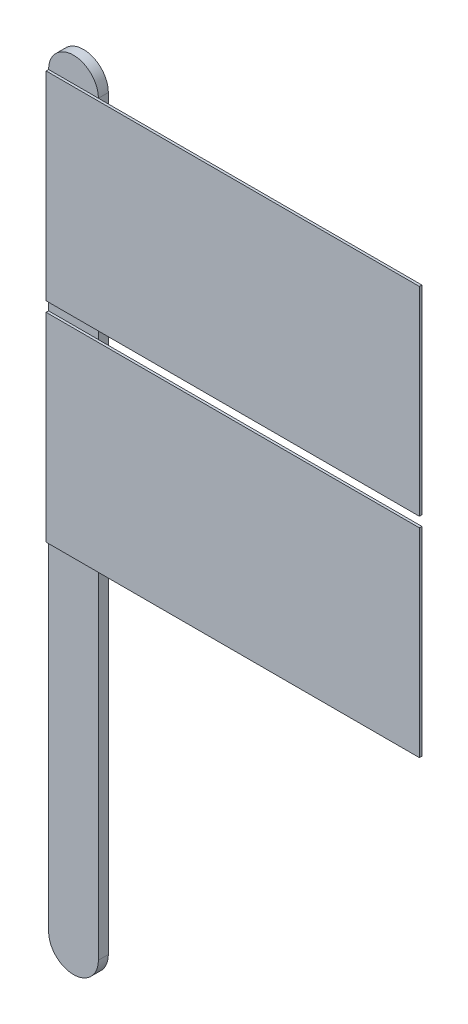
ISO-10303-21;
HEADER;
FILE_DESCRIPTION(('STEP AP214'),'2;1');
FILE_NAME('part.step','',(''),(''),'','','');
FILE_SCHEMA(('AUTOMOTIVE_DESIGN { 1 0 10303 214 1 1 1 1 }'));
ENDSEC;
DATA;
#1=APPLICATION_CONTEXT('core data for automotive mechanical design processes');
#2=APPLICATION_PROTOCOL_DEFINITION('international standard','automotive_design',2000,#1);
#3=PRODUCT_CONTEXT('',#1,'mechanical');
#4=PRODUCT('Part','Part','',(#3));
#5=PRODUCT_RELATED_PRODUCT_CATEGORY('part','',(#4));
#6=PRODUCT_DEFINITION_FORMATION('','',#4);
#7=PRODUCT_DEFINITION_CONTEXT('part definition',#1,'design');
#8=PRODUCT_DEFINITION('design','',#6,#7);
#9=PRODUCT_DEFINITION_SHAPE('','',#8);
#10=(LENGTH_UNIT() NAMED_UNIT(*) SI_UNIT(.MILLI.,.METRE.));
#11=(NAMED_UNIT(*) PLANE_ANGLE_UNIT() SI_UNIT($,.RADIAN.));
#12=(NAMED_UNIT(*) SI_UNIT($,.STERADIAN.) SOLID_ANGLE_UNIT());
#13=UNCERTAINTY_MEASURE_WITH_UNIT(LENGTH_MEASURE(1.E-05),#10,'distance_accuracy_value','');
#14=(GEOMETRIC_REPRESENTATION_CONTEXT(3) GLOBAL_UNCERTAINTY_ASSIGNED_CONTEXT((#13)) GLOBAL_UNIT_ASSIGNED_CONTEXT((#10,
#11,#12)) REPRESENTATION_CONTEXT('',''));
#15=CARTESIAN_POINT('',(0.,0.,0.));
#16=DIRECTION('',(0.,0.,1.));
#17=DIRECTION('',(1.,0.,0.));
#18=AXIS2_PLACEMENT_3D('',#15,#16,#17);
#19=CARTESIAN_POINT('',(0.,0.,2.));
#20=DIRECTION('',(0.,0.,1.));
#21=DIRECTION('',(1.,0.,0.));
#22=AXIS2_PLACEMENT_3D('',#19,#20,#21);
#23=PLANE('',#22);
#24=DIRECTION('',(0.,1.,0.));
#25=VECTOR('',#24,1.);
#26=CARTESIAN_POINT('',(5.,0.,2.));
#27=LINE('',#26,#25);
#28=CARTESIAN_POINT('',(5.,0.,2.));
#29=VERTEX_POINT('',#28);
#30=CARTESIAN_POINT('',(5.,68.,2.));
#31=VERTEX_POINT('',#30);
#32=EDGE_CURVE('E194',#29,#31,#27,.T.);
#33=ORIENTED_EDGE('',*,*,#32,.T.);
#34=DIRECTION('',(1.,0.,0.));
#35=VECTOR('',#34,1.);
#36=CARTESIAN_POINT('',(-5.,68.,2.));
#37=LINE('',#36,#35);
#38=CARTESIAN_POINT('',(-5.,68.,2.));
#39=VERTEX_POINT('',#38);
#40=EDGE_CURVE('E407',#39,#31,#37,.T.);
#41=ORIENTED_EDGE('',*,*,#40,.F.);
#42=DIRECTION('',(0.,-1.,0.));
#43=VECTOR('',#42,1.);
#44=CARTESIAN_POINT('',(-5.,0.,2.));
#45=LINE('',#44,#43);
#46=CARTESIAN_POINT('',(-5.,0.,2.));
#47=VERTEX_POINT('',#46);
#48=EDGE_CURVE('E154',#39,#47,#45,.T.);
#49=ORIENTED_EDGE('',*,*,#48,.T.);
#50=CARTESIAN_POINT('',(0.,0.,2.));
#51=DIRECTION('',(0.,0.,1.));
#52=DIRECTION('',(1.,0.,0.));
#53=AXIS2_PLACEMENT_3D('',#50,#51,#52);
#54=CIRCLE('',#53,5.);
#55=EDGE_CURVE('E189',#47,#29,#54,.T.);
#56=ORIENTED_EDGE('',*,*,#55,.T.);
#57=EDGE_LOOP('',(#33,#41,#49,#56));
#58=FACE_BOUND('',#57,.T.);
#59=ADVANCED_FACE('F33',(#58),#23,.T.);
#60=CARTESIAN_POINT('',(-5.,110.,2.));
#61=VERTEX_POINT('',#60);
#62=CARTESIAN_POINT('',(-5.,108.,2.));
#63=VERTEX_POINT('',#62);
#64=EDGE_CURVE('E201',#61,#63,#45,.T.);
#65=ORIENTED_EDGE('',*,*,#64,.T.);
#66=DIRECTION('',(1.,0.,0.));
#67=VECTOR('',#66,1.);
#68=CARTESIAN_POINT('',(0.,108.,2.));
#69=LINE('',#68,#67);
#70=CARTESIAN_POINT('',(5.,108.,2.));
#71=VERTEX_POINT('',#70);
#72=EDGE_CURVE('E11',#63,#71,#69,.T.);
#73=ORIENTED_EDGE('',*,*,#72,.T.);
#74=CARTESIAN_POINT('',(5.,110.,2.));
#75=VERTEX_POINT('',#74);
#76=EDGE_CURVE('E199',#71,#75,#27,.T.);
#77=ORIENTED_EDGE('',*,*,#76,.T.);
#78=DIRECTION('',(1.,0.,0.));
#79=VECTOR('',#78,1.);
#80=CARTESIAN_POINT('',(-4.99999999999999,110.,2.));
#81=LINE('',#80,#79);
#82=EDGE_CURVE('E56',#61,#75,#81,.T.);
#83=ORIENTED_EDGE('',*,*,#82,.F.);
#84=EDGE_LOOP('',(#65,#73,#77,#83));
#85=FACE_BOUND('',#84,.T.);
#86=ADVANCED_FACE('F252',(#85),#23,.T.);
#87=DIRECTION('',(-1.,0.,0.));
#88=VECTOR('',#87,1.);
#89=CARTESIAN_POINT('',(-5.,150.,2.));
#90=LINE('',#89,#88);
#91=CARTESIAN_POINT('',(5.,150.,2.));
#92=VERTEX_POINT('',#91);
#93=CARTESIAN_POINT('',(-5.,150.,2.));
#94=VERTEX_POINT('',#93);
#95=EDGE_CURVE('E41',#92,#94,#90,.T.);
#96=ORIENTED_EDGE('',*,*,#95,.F.);
#97=CARTESIAN_POINT('',(0.,150.,2.));
#98=DIRECTION('',(0.,0.,1.));
#99=DIRECTION('',(1.,0.,0.));
#100=AXIS2_PLACEMENT_3D('',#97,#98,#99);
#101=CIRCLE('',#100,5.);
#102=EDGE_CURVE('E197',#92,#94,#101,.T.);
#103=ORIENTED_EDGE('',*,*,#102,.T.);
#104=EDGE_LOOP('',(#96,#103));
#105=FACE_BOUND('',#104,.T.);
#106=ADVANCED_FACE('F262',(#105),#23,.T.);
#107=CARTESIAN_POINT('',(0.,0.,2.));
#108=DIRECTION('',(0.,0.,-1.));
#109=DIRECTION('',(-1.,0.,0.));
#110=AXIS2_PLACEMENT_3D('',#107,#108,#109);
#111=CYLINDRICAL_SURFACE('',#110,5.);
#112=CARTESIAN_POINT('',(0.,0.,0.));
#113=DIRECTION('',(0.,0.,1.));
#114=DIRECTION('',(1.,0.,0.));
#115=AXIS2_PLACEMENT_3D('',#112,#113,#114);
#116=CIRCLE('',#115,5.);
#117=CARTESIAN_POINT('',(-5.,0.,0.));
#118=VERTEX_POINT('',#117);
#119=CARTESIAN_POINT('',(5.,0.,0.));
#120=VERTEX_POINT('',#119);
#121=EDGE_CURVE('E188',#118,#120,#116,.T.);
#122=ORIENTED_EDGE('',*,*,#121,.T.);
#123=DIRECTION('',(0.,0.,-1.));
#124=VECTOR('',#123,1.);
#125=CARTESIAN_POINT('',(5.,0.,2.));
#126=LINE('',#125,#124);
#127=EDGE_CURVE('E218',#29,#120,#126,.T.);
#128=ORIENTED_EDGE('',*,*,#127,.F.);
#129=ORIENTED_EDGE('',*,*,#55,.F.);
#130=DIRECTION('',(0.,0.,-1.));
#131=VECTOR('',#130,1.);
#132=CARTESIAN_POINT('',(-5.,0.,2.));
#133=LINE('',#132,#131);
#134=EDGE_CURVE('E203',#47,#118,#133,.T.);
#135=ORIENTED_EDGE('',*,*,#134,.T.);
#136=EDGE_LOOP('',(#122,#128,#129,#135));
#137=FACE_BOUND('',#136,.T.);
#138=ADVANCED_FACE('F35',(#137),#111,.T.);
#139=CARTESIAN_POINT('',(5.,0.,2.));
#140=DIRECTION('',(-1.,0.,0.));
#141=DIRECTION('',(0.,0.,1.));
#142=AXIS2_PLACEMENT_3D('',#139,#140,#141);
#143=PLANE('',#142);
#144=DIRECTION('',(0.,1.,0.));
#145=VECTOR('',#144,1.);
#146=CARTESIAN_POINT('',(5.,0.,0.));
#147=LINE('',#146,#145);
#148=CARTESIAN_POINT('',(5.,150.,0.));
#149=VERTEX_POINT('',#148);
#150=EDGE_CURVE('E206',#120,#149,#147,.T.);
#151=ORIENTED_EDGE('',*,*,#150,.T.);
#152=DIRECTION('',(0.,0.,-1.));
#153=VECTOR('',#152,1.);
#154=CARTESIAN_POINT('',(5.,150.,2.));
#155=LINE('',#154,#153);
#156=EDGE_CURVE('E216',#92,#149,#155,.T.);
#157=ORIENTED_EDGE('',*,*,#156,.F.);
#158=EDGE_CURVE('E192',#75,#92,#27,.T.);
#159=ORIENTED_EDGE('',*,*,#158,.F.);
#160=ORIENTED_EDGE('',*,*,#76,.F.);
#161=EDGE_CURVE('E198',#31,#71,#27,.T.);
#162=ORIENTED_EDGE('',*,*,#161,.F.);
#163=ORIENTED_EDGE('',*,*,#32,.F.);
#164=ORIENTED_EDGE('',*,*,#127,.T.);
#165=EDGE_LOOP('',(#151,#157,#159,#160,#162,#163,#164));
#166=FACE_BOUND('',#165,.T.);
#167=ADVANCED_FACE('F253',(#166),#143,.F.);
#168=CARTESIAN_POINT('',(0.,150.,2.));
#169=DIRECTION('',(0.,0.,-1.));
#170=DIRECTION('',(-1.,0.,0.));
#171=AXIS2_PLACEMENT_3D('',#168,#169,#170);
#172=CYLINDRICAL_SURFACE('',#171,5.);
#173=CARTESIAN_POINT('',(0.,150.,0.));
#174=DIRECTION('',(0.,0.,1.));
#175=DIRECTION('',(1.,0.,0.));
#176=AXIS2_PLACEMENT_3D('',#173,#174,#175);
#177=CIRCLE('',#176,5.);
#178=CARTESIAN_POINT('',(-5.,150.,0.));
#179=VERTEX_POINT('',#178);
#180=EDGE_CURVE('E208',#149,#179,#177,.T.);
#181=ORIENTED_EDGE('',*,*,#180,.T.);
#182=DIRECTION('',(0.,0.,-1.));
#183=VECTOR('',#182,1.);
#184=CARTESIAN_POINT('',(-5.,150.,2.));
#185=LINE('',#184,#183);
#186=EDGE_CURVE('E213',#94,#179,#185,.T.);
#187=ORIENTED_EDGE('',*,*,#186,.F.);
#188=ORIENTED_EDGE('',*,*,#102,.F.);
#189=ORIENTED_EDGE('',*,*,#156,.T.);
#190=EDGE_LOOP('',(#181,#187,#188,#189));
#191=FACE_BOUND('',#190,.T.);
#192=ADVANCED_FACE('F255',(#191),#172,.T.);
#193=CARTESIAN_POINT('',(-5.,0.,2.));
#194=DIRECTION('',(1.,0.,0.));
#195=DIRECTION('',(0.,0.,-1.));
#196=AXIS2_PLACEMENT_3D('',#193,#194,#195);
#197=PLANE('',#196);
#198=DIRECTION('',(0.,-1.,0.));
#199=VECTOR('',#198,1.);
#200=CARTESIAN_POINT('',(-5.,0.,0.));
#201=LINE('',#200,#199);
#202=EDGE_CURVE('E193',#179,#118,#201,.T.);
#203=ORIENTED_EDGE('',*,*,#202,.T.);
#204=ORIENTED_EDGE('',*,*,#134,.F.);
#205=ORIENTED_EDGE('',*,*,#48,.F.);
#206=DIRECTION('',(0.,0.,-1.));
#207=VECTOR('',#206,1.);
#208=CARTESIAN_POINT('',(-5.,68.,2.5));
#209=LINE('',#208,#207);
#210=CARTESIAN_POINT('',(-5.,68.,2.5));
#211=VERTEX_POINT('',#210);
#212=EDGE_CURVE('E134',#211,#39,#209,.T.);
#213=ORIENTED_EDGE('',*,*,#212,.F.);
#214=DIRECTION('',(0.,-1.,0.));
#215=VECTOR('',#214,1.);
#216=CARTESIAN_POINT('',(-5.,108.,2.5));
#217=LINE('',#216,#215);
#218=CARTESIAN_POINT('',(-5.,108.,2.5));
#219=VERTEX_POINT('',#218);
#220=EDGE_CURVE('E141',#219,#211,#217,.T.);
#221=ORIENTED_EDGE('',*,*,#220,.F.);
#222=DIRECTION('',(0.,0.,-1.));
#223=VECTOR('',#222,1.);
#224=CARTESIAN_POINT('',(-5.,108.,2.5));
#225=LINE('',#224,#223);
#226=EDGE_CURVE('E409',#219,#63,#225,.T.);
#227=ORIENTED_EDGE('',*,*,#226,.T.);
#228=ORIENTED_EDGE('',*,*,#64,.F.);
#229=DIRECTION('',(0.,0.,-1.));
#230=VECTOR('',#229,1.);
#231=CARTESIAN_POINT('',(-4.99999999999999,110.,2.5));
#232=LINE('',#231,#230);
#233=CARTESIAN_POINT('',(-4.99999999999999,110.,2.5));
#234=VERTEX_POINT('',#233);
#235=EDGE_CURVE('E185',#234,#61,#232,.T.);
#236=ORIENTED_EDGE('',*,*,#235,.F.);
#237=DIRECTION('',(0.,-1.,0.));
#238=VECTOR('',#237,1.);
#239=CARTESIAN_POINT('',(-5.,150.,2.5));
#240=LINE('',#239,#238);
#241=CARTESIAN_POINT('',(-5.,150.,2.5));
#242=VERTEX_POINT('',#241);
#243=EDGE_CURVE('E162',#242,#234,#240,.T.);
#244=ORIENTED_EDGE('',*,*,#243,.F.);
#245=DIRECTION('',(0.,0.,-1.));
#246=VECTOR('',#245,1.);
#247=CARTESIAN_POINT('',(-5.,150.,2.5));
#248=LINE('',#247,#246);
#249=EDGE_CURVE('E171',#242,#94,#248,.T.);
#250=ORIENTED_EDGE('',*,*,#249,.T.);
#251=ORIENTED_EDGE('',*,*,#186,.T.);
#252=EDGE_LOOP('',(#203,#204,#205,#213,#221,#227,#228,#236,#244,#250,#251));
#253=FACE_BOUND('',#252,.T.);
#254=ADVANCED_FACE('F152',(#253),#197,.F.);
#255=CARTESIAN_POINT('',(0.,0.,0.));
#256=DIRECTION('',(0.,0.,1.));
#257=DIRECTION('',(1.,0.,0.));
#258=AXIS2_PLACEMENT_3D('',#255,#256,#257);
#259=PLANE('',#258);
#260=ORIENTED_EDGE('',*,*,#121,.F.);
#261=ORIENTED_EDGE('',*,*,#202,.F.);
#262=ORIENTED_EDGE('',*,*,#180,.F.);
#263=ORIENTED_EDGE('',*,*,#150,.F.);
#264=EDGE_LOOP('',(#260,#261,#262,#263));
#265=FACE_BOUND('',#264,.T.);
#266=ADVANCED_FACE('F287',(#265),#259,.F.);
#267=CARTESIAN_POINT('',(0.,0.,2.));
#268=DIRECTION('',(0.,0.,1.));
#269=DIRECTION('',(1.,0.,0.));
#270=AXIS2_PLACEMENT_3D('',#267,#268,#269);
#271=PLANE('',#270);
#272=CARTESIAN_POINT('',(70.,110.,2.));
#273=VERTEX_POINT('',#272);
#274=EDGE_CURVE('E155',#75,#273,#81,.T.);
#275=ORIENTED_EDGE('',*,*,#274,.F.);
#276=ORIENTED_EDGE('',*,*,#158,.T.);
#277=CARTESIAN_POINT('',(70.,150.,2.));
#278=VERTEX_POINT('',#277);
#279=EDGE_CURVE('E166',#278,#92,#90,.T.);
#280=ORIENTED_EDGE('',*,*,#279,.F.);
#281=DIRECTION('',(0.,1.,0.));
#282=VECTOR('',#281,1.);
#283=CARTESIAN_POINT('',(70.,150.,2.));
#284=LINE('',#283,#282);
#285=EDGE_CURVE('E173',#273,#278,#284,.T.);
#286=ORIENTED_EDGE('',*,*,#285,.F.);
#287=EDGE_LOOP('',(#275,#276,#280,#286));
#288=FACE_BOUND('',#287,.T.);
#289=ADVANCED_FACE('F244',(#288),#271,.F.);
#290=CARTESIAN_POINT('',(-4.99999999999999,110.,2.5));
#291=DIRECTION('',(0.,1.,0.));
#292=DIRECTION('',(0.,0.,1.));
#293=AXIS2_PLACEMENT_3D('',#290,#291,#292);
#294=PLANE('',#293);
#295=ORIENTED_EDGE('',*,*,#82,.T.);
#296=ORIENTED_EDGE('',*,*,#274,.T.);
#297=DIRECTION('',(0.,0.,-1.));
#298=VECTOR('',#297,1.);
#299=CARTESIAN_POINT('',(70.,110.,2.5));
#300=LINE('',#299,#298);
#301=CARTESIAN_POINT('',(70.,110.,2.5));
#302=VERTEX_POINT('',#301);
#303=EDGE_CURVE('E182',#302,#273,#300,.T.);
#304=ORIENTED_EDGE('',*,*,#303,.F.);
#305=DIRECTION('',(1.,0.,0.));
#306=VECTOR('',#305,1.);
#307=CARTESIAN_POINT('',(-4.99999999999999,110.,2.5));
#308=LINE('',#307,#306);
#309=EDGE_CURVE('E165',#234,#302,#308,.T.);
#310=ORIENTED_EDGE('',*,*,#309,.F.);
#311=ORIENTED_EDGE('',*,*,#235,.T.);
#312=EDGE_LOOP('',(#295,#296,#304,#310,#311));
#313=FACE_BOUND('',#312,.T.);
#314=ADVANCED_FACE('F326',(#313),#294,.F.);
#315=CARTESIAN_POINT('',(70.,150.,2.5));
#316=DIRECTION('',(-1.,0.,0.));
#317=DIRECTION('',(0.,0.,1.));
#318=AXIS2_PLACEMENT_3D('',#315,#316,#317);
#319=PLANE('',#318);
#320=ORIENTED_EDGE('',*,*,#285,.T.);
#321=DIRECTION('',(0.,0.,-1.));
#322=VECTOR('',#321,1.);
#323=CARTESIAN_POINT('',(70.,150.,2.5));
#324=LINE('',#323,#322);
#325=CARTESIAN_POINT('',(70.,150.,2.5));
#326=VERTEX_POINT('',#325);
#327=EDGE_CURVE('E179',#326,#278,#324,.T.);
#328=ORIENTED_EDGE('',*,*,#327,.F.);
#329=DIRECTION('',(0.,1.,0.));
#330=VECTOR('',#329,1.);
#331=CARTESIAN_POINT('',(70.,150.,2.5));
#332=LINE('',#331,#330);
#333=EDGE_CURVE('E168',#302,#326,#332,.T.);
#334=ORIENTED_EDGE('',*,*,#333,.F.);
#335=ORIENTED_EDGE('',*,*,#303,.T.);
#336=EDGE_LOOP('',(#320,#328,#334,#335));
#337=FACE_BOUND('',#336,.T.);
#338=ADVANCED_FACE('F334',(#337),#319,.F.);
#339=CARTESIAN_POINT('',(-5.,150.,2.5));
#340=DIRECTION('',(0.,-1.,0.));
#341=DIRECTION('',(0.,0.,-1.));
#342=AXIS2_PLACEMENT_3D('',#339,#340,#341);
#343=PLANE('',#342);
#344=ORIENTED_EDGE('',*,*,#279,.T.);
#345=ORIENTED_EDGE('',*,*,#95,.T.);
#346=ORIENTED_EDGE('',*,*,#249,.F.);
#347=DIRECTION('',(-1.,0.,0.));
#348=VECTOR('',#347,1.);
#349=CARTESIAN_POINT('',(-5.,150.,2.5));
#350=LINE('',#349,#348);
#351=EDGE_CURVE('E170',#326,#242,#350,.T.);
#352=ORIENTED_EDGE('',*,*,#351,.F.);
#353=ORIENTED_EDGE('',*,*,#327,.T.);
#354=EDGE_LOOP('',(#344,#345,#346,#352,#353));
#355=FACE_BOUND('',#354,.T.);
#356=ADVANCED_FACE('F225',(#355),#343,.F.);
#357=CARTESIAN_POINT('',(0.,0.,2.5));
#358=DIRECTION('',(0.,0.,1.));
#359=DIRECTION('',(1.,0.,0.));
#360=AXIS2_PLACEMENT_3D('',#357,#358,#359);
#361=PLANE('',#360);
#362=ORIENTED_EDGE('',*,*,#243,.T.);
#363=ORIENTED_EDGE('',*,*,#309,.T.);
#364=ORIENTED_EDGE('',*,*,#333,.T.);
#365=ORIENTED_EDGE('',*,*,#351,.T.);
#366=EDGE_LOOP('',(#362,#363,#364,#365));
#367=FACE_BOUND('',#366,.T.);
#368=ADVANCED_FACE('F235',(#367),#361,.T.);
#369=CARTESIAN_POINT('',(0.,0.,2.));
#370=DIRECTION('',(0.,0.,1.));
#371=DIRECTION('',(1.,0.,0.));
#372=AXIS2_PLACEMENT_3D('',#369,#370,#371);
#373=PLANE('',#372);
#374=CARTESIAN_POINT('',(70.,68.,2.));
#375=VERTEX_POINT('',#374);
#376=EDGE_CURVE('E251',#31,#375,#37,.T.);
#377=ORIENTED_EDGE('',*,*,#376,.F.);
#378=ORIENTED_EDGE('',*,*,#161,.T.);
#379=DIRECTION('',(-1.,0.,0.));
#380=VECTOR('',#379,1.);
#381=CARTESIAN_POINT('',(-5.,108.,2.));
#382=LINE('',#381,#380);
#383=CARTESIAN_POINT('',(70.,108.,2.));
#384=VERTEX_POINT('',#383);
#385=EDGE_CURVE('E48',#384,#71,#382,.T.);
#386=ORIENTED_EDGE('',*,*,#385,.F.);
#387=DIRECTION('',(0.,1.,0.));
#388=VECTOR('',#387,1.);
#389=CARTESIAN_POINT('',(70.,108.,2.));
#390=LINE('',#389,#388);
#391=EDGE_CURVE('E406',#375,#384,#390,.T.);
#392=ORIENTED_EDGE('',*,*,#391,.F.);
#393=EDGE_LOOP('',(#377,#378,#386,#392));
#394=FACE_BOUND('',#393,.T.);
#395=ADVANCED_FACE('F249',(#394),#373,.F.);
#396=CARTESIAN_POINT('',(-5.,68.,2.5));
#397=DIRECTION('',(0.,1.,0.));
#398=DIRECTION('',(0.,0.,1.));
#399=AXIS2_PLACEMENT_3D('',#396,#397,#398);
#400=PLANE('',#399);
#401=ORIENTED_EDGE('',*,*,#40,.T.);
#402=ORIENTED_EDGE('',*,*,#376,.T.);
#403=DIRECTION('',(0.,0.,-1.));
#404=VECTOR('',#403,1.);
#405=CARTESIAN_POINT('',(70.,68.,2.5));
#406=LINE('',#405,#404);
#407=CARTESIAN_POINT('',(70.,68.,2.5));
#408=VERTEX_POINT('',#407);
#409=EDGE_CURVE('E137',#408,#375,#406,.T.);
#410=ORIENTED_EDGE('',*,*,#409,.F.);
#411=DIRECTION('',(1.,0.,0.));
#412=VECTOR('',#411,1.);
#413=CARTESIAN_POINT('',(-5.,68.,2.5));
#414=LINE('',#413,#412);
#415=EDGE_CURVE('E129',#211,#408,#414,.T.);
#416=ORIENTED_EDGE('',*,*,#415,.F.);
#417=ORIENTED_EDGE('',*,*,#212,.T.);
#418=EDGE_LOOP('',(#401,#402,#410,#416,#417));
#419=FACE_BOUND('',#418,.T.);
#420=ADVANCED_FACE('F132',(#419),#400,.F.);
#421=CARTESIAN_POINT('',(70.,108.,2.5));
#422=DIRECTION('',(-1.,0.,0.));
#423=DIRECTION('',(0.,-1.,0.));
#424=AXIS2_PLACEMENT_3D('',#421,#422,#423);
#425=PLANE('',#424);
#426=ORIENTED_EDGE('',*,*,#391,.T.);
#427=DIRECTION('',(0.,0.,-1.));
#428=VECTOR('',#427,1.);
#429=CARTESIAN_POINT('',(70.,108.,2.5));
#430=LINE('',#429,#428);
#431=CARTESIAN_POINT('',(70.,108.,2.5));
#432=VERTEX_POINT('',#431);
#433=EDGE_CURVE('E158',#432,#384,#430,.T.);
#434=ORIENTED_EDGE('',*,*,#433,.F.);
#435=DIRECTION('',(0.,1.,0.));
#436=VECTOR('',#435,1.);
#437=CARTESIAN_POINT('',(70.,108.,2.5));
#438=LINE('',#437,#436);
#439=EDGE_CURVE('E140',#408,#432,#438,.T.);
#440=ORIENTED_EDGE('',*,*,#439,.F.);
#441=ORIENTED_EDGE('',*,*,#409,.T.);
#442=EDGE_LOOP('',(#426,#434,#440,#441));
#443=FACE_BOUND('',#442,.T.);
#444=ADVANCED_FACE('F370',(#443),#425,.F.);
#445=CARTESIAN_POINT('',(-5.,108.,2.5));
#446=DIRECTION('',(0.,-1.,0.));
#447=DIRECTION('',(0.,0.,-1.));
#448=AXIS2_PLACEMENT_3D('',#445,#446,#447);
#449=PLANE('',#448);
#450=ORIENTED_EDGE('',*,*,#385,.T.);
#451=ORIENTED_EDGE('',*,*,#72,.F.);
#452=ORIENTED_EDGE('',*,*,#226,.F.);
#453=DIRECTION('',(-1.,0.,0.));
#454=VECTOR('',#453,1.);
#455=CARTESIAN_POINT('',(-5.,108.,2.5));
#456=LINE('',#455,#454);
#457=EDGE_CURVE('E146',#432,#219,#456,.T.);
#458=ORIENTED_EDGE('',*,*,#457,.F.);
#459=ORIENTED_EDGE('',*,*,#433,.T.);
#460=EDGE_LOOP('',(#450,#451,#452,#458,#459));
#461=FACE_BOUND('',#460,.T.);
#462=ADVANCED_FACE('F378',(#461),#449,.F.);
#463=CARTESIAN_POINT('',(0.,0.,2.5));
#464=DIRECTION('',(0.,0.,1.));
#465=DIRECTION('',(1.,0.,0.));
#466=AXIS2_PLACEMENT_3D('',#463,#464,#465);
#467=PLANE('',#466);
#468=ORIENTED_EDGE('',*,*,#220,.T.);
#469=ORIENTED_EDGE('',*,*,#415,.T.);
#470=ORIENTED_EDGE('',*,*,#439,.T.);
#471=ORIENTED_EDGE('',*,*,#457,.T.);
#472=EDGE_LOOP('',(#468,#469,#470,#471));
#473=FACE_BOUND('',#472,.T.);
#474=ADVANCED_FACE('F144',(#473),#467,.T.);
#475=CLOSED_SHELL('',(#59,#86,#106,#138,#167,#192,#254,#266,#289,#314,#338,#356,#368,#395,#420,
#444,#462,#474));
#476=MANIFOLD_SOLID_BREP('B2',#475);
#477=ADVANCED_BREP_SHAPE_REPRESENTATION('',(#18,#476),#14);
#478=SHAPE_DEFINITION_REPRESENTATION(#9,#477);
ENDSEC;
END-ISO-10303-21;
